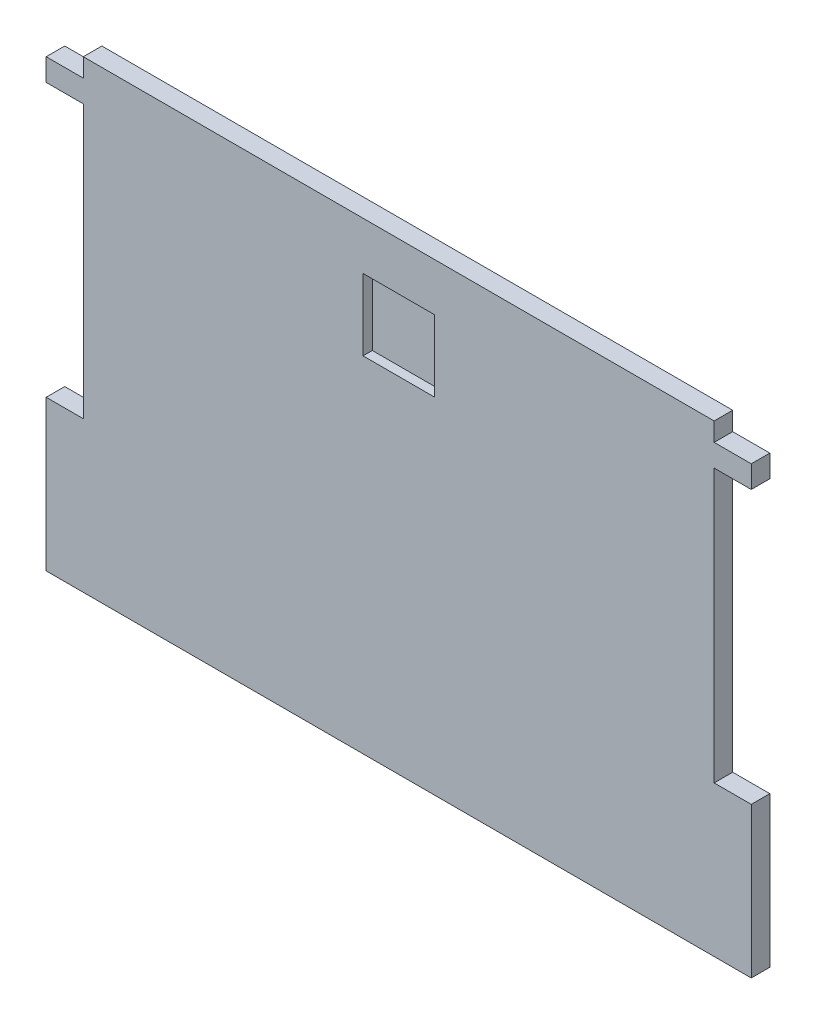
ISO-10303-21;
HEADER;
FILE_DESCRIPTION(('STEP AP214'),'2;1');
FILE_NAME('part.step','',(''),(''),'','','');
FILE_SCHEMA(('AUTOMOTIVE_DESIGN { 1 0 10303 214 1 1 1 1 }'));
ENDSEC;
DATA;
#1=APPLICATION_CONTEXT('core data for automotive mechanical design processes');
#2=APPLICATION_PROTOCOL_DEFINITION('international standard','automotive_design',2000,#1);
#3=PRODUCT_CONTEXT('',#1,'mechanical');
#4=PRODUCT('Part','Part','',(#3));
#5=PRODUCT_RELATED_PRODUCT_CATEGORY('part','',(#4));
#6=PRODUCT_DEFINITION_FORMATION('','',#4);
#7=PRODUCT_DEFINITION_CONTEXT('part definition',#1,'design');
#8=PRODUCT_DEFINITION('design','',#6,#7);
#9=PRODUCT_DEFINITION_SHAPE('','',#8);
#10=(LENGTH_UNIT() NAMED_UNIT(*) SI_UNIT(.MILLI.,.METRE.));
#11=(NAMED_UNIT(*) PLANE_ANGLE_UNIT() SI_UNIT($,.RADIAN.));
#12=(NAMED_UNIT(*) SI_UNIT($,.STERADIAN.) SOLID_ANGLE_UNIT());
#13=UNCERTAINTY_MEASURE_WITH_UNIT(LENGTH_MEASURE(1.E-05),#10,'distance_accuracy_value','');
#14=(GEOMETRIC_REPRESENTATION_CONTEXT(3) GLOBAL_UNCERTAINTY_ASSIGNED_CONTEXT((#13)) GLOBAL_UNIT_ASSIGNED_CONTEXT((#10,
#11,#12)) REPRESENTATION_CONTEXT('',''));
#15=CARTESIAN_POINT('',(0.,0.,0.));
#16=DIRECTION('',(0.,0.,1.));
#17=DIRECTION('',(1.,0.,0.));
#18=AXIS2_PLACEMENT_3D('',#15,#16,#17);
#19=CARTESIAN_POINT('',(0.,0.,1.));
#20=DIRECTION('',(0.,0.,-1.));
#21=DIRECTION('',(-1.,0.,0.));
#22=AXIS2_PLACEMENT_3D('',#19,#20,#21);
#23=PLANE('',#22);
#24=DIRECTION('',(-1.,0.,0.));
#25=VECTOR('',#24,1.);
#26=CARTESIAN_POINT('',(-17.,-0.5,1.));
#27=LINE('',#26,#25);
#28=CARTESIAN_POINT('',(17.,-0.5,1.));
#29=VERTEX_POINT('',#28);
#30=CARTESIAN_POINT('',(-17.,-0.5,1.));
#31=VERTEX_POINT('',#30);
#32=EDGE_CURVE('E244',#29,#31,#27,.T.);
#33=ORIENTED_EDGE('',*,*,#32,.T.);
#34=DIRECTION('',(0.,-1.,0.));
#35=VECTOR('',#34,1.);
#36=CARTESIAN_POINT('',(-17.,-1.5,1.));
#37=LINE('',#36,#35);
#38=CARTESIAN_POINT('',(-17.,-1.5,1.));
#39=VERTEX_POINT('',#38);
#40=EDGE_CURVE('E117',#31,#39,#37,.T.);
#41=ORIENTED_EDGE('',*,*,#40,.T.);
#42=DIRECTION('',(-1.,0.,0.));
#43=VECTOR('',#42,1.);
#44=CARTESIAN_POINT('',(-19.,-1.5,1.));
#45=LINE('',#44,#43);
#46=CARTESIAN_POINT('',(-19.,-1.5,1.));
#47=VERTEX_POINT('',#46);
#48=EDGE_CURVE('E236',#39,#47,#45,.T.);
#49=ORIENTED_EDGE('',*,*,#48,.T.);
#50=DIRECTION('',(0.,-1.,0.));
#51=VECTOR('',#50,1.);
#52=CARTESIAN_POINT('',(-19.,-2.7,1.));
#53=LINE('',#52,#51);
#54=CARTESIAN_POINT('',(-19.,-2.7,1.));
#55=VERTEX_POINT('',#54);
#56=EDGE_CURVE('E240',#47,#55,#53,.T.);
#57=ORIENTED_EDGE('',*,*,#56,.T.);
#58=DIRECTION('',(1.,0.,0.));
#59=VECTOR('',#58,1.);
#60=CARTESIAN_POINT('',(-17.,-2.7,1.));
#61=LINE('',#60,#59);
#62=CARTESIAN_POINT('',(-17.,-2.7,1.));
#63=VERTEX_POINT('',#62);
#64=EDGE_CURVE('E234',#55,#63,#61,.T.);
#65=ORIENTED_EDGE('',*,*,#64,.T.);
#66=DIRECTION('',(0.,-1.,0.));
#67=VECTOR('',#66,1.);
#68=CARTESIAN_POINT('',(-17.,-17.3947217067352,1.));
#69=LINE('',#68,#67);
#70=CARTESIAN_POINT('',(-17.,-17.3947217067352,1.));
#71=VERTEX_POINT('',#70);
#72=EDGE_CURVE('E232',#63,#71,#69,.T.);
#73=ORIENTED_EDGE('',*,*,#72,.T.);
#74=DIRECTION('',(-1.,0.,0.));
#75=VECTOR('',#74,1.);
#76=CARTESIAN_POINT('',(-19.,-17.3947217067352,1.));
#77=LINE('',#76,#75);
#78=CARTESIAN_POINT('',(-19.,-17.3947217067352,1.));
#79=VERTEX_POINT('',#78);
#80=EDGE_CURVE('E231',#71,#79,#77,.T.);
#81=ORIENTED_EDGE('',*,*,#80,.T.);
#82=DIRECTION('',(0.,-1.,0.));
#83=VECTOR('',#82,1.);
#84=CARTESIAN_POINT('',(-19.,-25.5,1.));
#85=LINE('',#84,#83);
#86=CARTESIAN_POINT('',(-19.,-25.5,1.));
#87=VERTEX_POINT('',#86);
#88=EDGE_CURVE('E227',#79,#87,#85,.T.);
#89=ORIENTED_EDGE('',*,*,#88,.T.);
#90=DIRECTION('',(1.,0.,0.));
#91=VECTOR('',#90,1.);
#92=CARTESIAN_POINT('',(19.,-25.5,1.));
#93=LINE('',#92,#91);
#94=CARTESIAN_POINT('',(19.,-25.5,1.));
#95=VERTEX_POINT('',#94);
#96=EDGE_CURVE('E230',#87,#95,#93,.T.);
#97=ORIENTED_EDGE('',*,*,#96,.T.);
#98=DIRECTION('',(0.,1.,0.));
#99=VECTOR('',#98,1.);
#100=CARTESIAN_POINT('',(19.,-17.3947217067352,1.));
#101=LINE('',#100,#99);
#102=CARTESIAN_POINT('',(19.,-17.3947217067352,1.));
#103=VERTEX_POINT('',#102);
#104=EDGE_CURVE('E224',#95,#103,#101,.T.);
#105=ORIENTED_EDGE('',*,*,#104,.T.);
#106=DIRECTION('',(-1.,0.,0.));
#107=VECTOR('',#106,1.);
#108=CARTESIAN_POINT('',(17.,-17.3947217067352,1.));
#109=LINE('',#108,#107);
#110=CARTESIAN_POINT('',(17.,-17.3947217067352,1.));
#111=VERTEX_POINT('',#110);
#112=EDGE_CURVE('E223',#103,#111,#109,.T.);
#113=ORIENTED_EDGE('',*,*,#112,.T.);
#114=DIRECTION('',(0.,1.,0.));
#115=VECTOR('',#114,1.);
#116=CARTESIAN_POINT('',(17.,-2.7,1.));
#117=LINE('',#116,#115);
#118=CARTESIAN_POINT('',(17.,-2.7,1.));
#119=VERTEX_POINT('',#118);
#120=EDGE_CURVE('E221',#111,#119,#117,.T.);
#121=ORIENTED_EDGE('',*,*,#120,.T.);
#122=DIRECTION('',(1.,0.,0.));
#123=VECTOR('',#122,1.);
#124=CARTESIAN_POINT('',(19.,-2.7,1.));
#125=LINE('',#124,#123);
#126=CARTESIAN_POINT('',(19.,-2.7,1.));
#127=VERTEX_POINT('',#126);
#128=EDGE_CURVE('E219',#119,#127,#125,.T.);
#129=ORIENTED_EDGE('',*,*,#128,.T.);
#130=DIRECTION('',(0.,1.,0.));
#131=VECTOR('',#130,1.);
#132=CARTESIAN_POINT('',(19.,-1.5,1.));
#133=LINE('',#132,#131);
#134=CARTESIAN_POINT('',(19.,-1.5,1.));
#135=VERTEX_POINT('',#134);
#136=EDGE_CURVE('E220',#127,#135,#133,.T.);
#137=ORIENTED_EDGE('',*,*,#136,.T.);
#138=DIRECTION('',(-1.,0.,0.));
#139=VECTOR('',#138,1.);
#140=CARTESIAN_POINT('',(17.,-1.5,1.));
#141=LINE('',#140,#139);
#142=CARTESIAN_POINT('',(17.,-1.5,1.));
#143=VERTEX_POINT('',#142);
#144=EDGE_CURVE('E215',#135,#143,#141,.T.);
#145=ORIENTED_EDGE('',*,*,#144,.T.);
#146=DIRECTION('',(0.,1.,0.));
#147=VECTOR('',#146,1.);
#148=CARTESIAN_POINT('',(17.,-0.5,1.));
#149=LINE('',#148,#147);
#150=EDGE_CURVE('E212',#143,#29,#149,.T.);
#151=ORIENTED_EDGE('',*,*,#150,.T.);
#152=EDGE_LOOP('',(#33,#41,#49,#57,#65,#73,#81,#89,#97,#105,#113,#121,#129,#137,#145,#151));
#153=FACE_BOUND('',#152,.T.);
#154=DIRECTION('',(1.,0.,0.));
#155=VECTOR('',#154,1.);
#156=CARTESIAN_POINT('',(-1.92307692307796,-3.07692307692307,1.));
#157=LINE('',#156,#155);
#158=CARTESIAN_POINT('',(-1.92307692307796,-3.07692307692307,1.));
#159=VERTEX_POINT('',#158);
#160=CARTESIAN_POINT('',(1.92307692307589,-3.07692307692307,1.));
#161=VERTEX_POINT('',#160);
#162=EDGE_CURVE('E53',#159,#161,#157,.T.);
#163=ORIENTED_EDGE('',*,*,#162,.T.);
#164=DIRECTION('',(0.,-1.,0.));
#165=VECTOR('',#164,1.);
#166=CARTESIAN_POINT('',(1.92307692307589,-3.07692307692307,1.));
#167=LINE('',#166,#165);
#168=CARTESIAN_POINT('',(1.92307692307589,-6.92307692307692,1.));
#169=VERTEX_POINT('',#168);
#170=EDGE_CURVE('E205',#161,#169,#167,.T.);
#171=ORIENTED_EDGE('',*,*,#170,.T.);
#172=DIRECTION('',(-1.,0.,0.));
#173=VECTOR('',#172,1.);
#174=CARTESIAN_POINT('',(1.92307692307589,-6.92307692307692,1.));
#175=LINE('',#174,#173);
#176=CARTESIAN_POINT('',(-1.92307692307796,-6.92307692307692,1.));
#177=VERTEX_POINT('',#176);
#178=EDGE_CURVE('E586',#169,#177,#175,.T.);
#179=ORIENTED_EDGE('',*,*,#178,.T.);
#180=DIRECTION('',(0.,1.,0.));
#181=VECTOR('',#180,1.);
#182=CARTESIAN_POINT('',(-1.92307692307796,-6.92307692307692,1.));
#183=LINE('',#182,#181);
#184=EDGE_CURVE('E200',#177,#159,#183,.T.);
#185=ORIENTED_EDGE('',*,*,#184,.T.);
#186=EDGE_LOOP('',(#163,#171,#179,#185));
#187=FACE_BOUND('',#186,.T.);
#188=ADVANCED_FACE('F39',(#153,#187),#23,.F.);
#189=CARTESIAN_POINT('',(-17.,-0.5,1.));
#190=DIRECTION('',(0.,-1.,0.));
#191=DIRECTION('',(0.,0.,-1.));
#192=AXIS2_PLACEMENT_3D('',#189,#190,#191);
#193=PLANE('',#192);
#194=DIRECTION('',(1.,0.,0.));
#195=VECTOR('',#194,1.);
#196=CARTESIAN_POINT('',(-17.,-0.5,0.));
#197=LINE('',#196,#195);
#198=CARTESIAN_POINT('',(17.,-0.5,0.));
#199=VERTEX_POINT('',#198);
#200=CARTESIAN_POINT('',(-17.,-0.5,0.));
#201=VERTEX_POINT('',#200);
#202=EDGE_CURVE('E11',#199,#201,#197,.F.);
#203=ORIENTED_EDGE('',*,*,#202,.T.);
#204=DIRECTION('',(0.,0.,-1.));
#205=VECTOR('',#204,1.);
#206=CARTESIAN_POINT('',(-17.,-0.5,1.));
#207=LINE('',#206,#205);
#208=EDGE_CURVE('E201',#31,#201,#207,.T.);
#209=ORIENTED_EDGE('',*,*,#208,.F.);
#210=ORIENTED_EDGE('',*,*,#32,.F.);
#211=DIRECTION('',(0.,0.,-1.));
#212=VECTOR('',#211,1.);
#213=CARTESIAN_POINT('',(17.,-0.5,1.));
#214=LINE('',#213,#212);
#215=EDGE_CURVE('E214',#29,#199,#214,.T.);
#216=ORIENTED_EDGE('',*,*,#215,.T.);
#217=EDGE_LOOP('',(#203,#209,#210,#216));
#218=FACE_BOUND('',#217,.T.);
#219=ADVANCED_FACE('F387',(#218),#193,.F.);
#220=CARTESIAN_POINT('',(-17.,-1.5,1.));
#221=DIRECTION('',(1.,0.,0.));
#222=DIRECTION('',(0.,0.,-1.));
#223=AXIS2_PLACEMENT_3D('',#220,#221,#222);
#224=PLANE('',#223);
#225=DIRECTION('',(0.,1.,0.));
#226=VECTOR('',#225,1.);
#227=CARTESIAN_POINT('',(-17.,-1.5,0.));
#228=LINE('',#227,#226);
#229=CARTESIAN_POINT('',(-17.,-1.5,0.));
#230=VERTEX_POINT('',#229);
#231=EDGE_CURVE('E50',#201,#230,#228,.F.);
#232=ORIENTED_EDGE('',*,*,#231,.T.);
#233=DIRECTION('',(0.,0.,-1.));
#234=VECTOR('',#233,1.);
#235=CARTESIAN_POINT('',(-17.,-1.5,1.));
#236=LINE('',#235,#234);
#237=EDGE_CURVE('E207',#39,#230,#236,.T.);
#238=ORIENTED_EDGE('',*,*,#237,.F.);
#239=ORIENTED_EDGE('',*,*,#40,.F.);
#240=ORIENTED_EDGE('',*,*,#208,.T.);
#241=EDGE_LOOP('',(#232,#238,#239,#240));
#242=FACE_BOUND('',#241,.T.);
#243=ADVANCED_FACE('F311',(#242),#224,.F.);
#244=CARTESIAN_POINT('',(-19.,-1.5,1.));
#245=DIRECTION('',(0.,-1.,0.));
#246=DIRECTION('',(1.,0.,0.));
#247=AXIS2_PLACEMENT_3D('',#244,#245,#246);
#248=PLANE('',#247);
#249=DIRECTION('',(1.,0.,0.));
#250=VECTOR('',#249,1.);
#251=CARTESIAN_POINT('',(-19.,-1.5,0.));
#252=LINE('',#251,#250);
#253=CARTESIAN_POINT('',(-19.,-1.5,0.));
#254=VERTEX_POINT('',#253);
#255=EDGE_CURVE('E307',#230,#254,#252,.F.);
#256=ORIENTED_EDGE('',*,*,#255,.T.);
#257=DIRECTION('',(0.,0.,-1.));
#258=VECTOR('',#257,1.);
#259=CARTESIAN_POINT('',(-19.,-1.5,1.));
#260=LINE('',#259,#258);
#261=EDGE_CURVE('E246',#47,#254,#260,.T.);
#262=ORIENTED_EDGE('',*,*,#261,.F.);
#263=ORIENTED_EDGE('',*,*,#48,.F.);
#264=ORIENTED_EDGE('',*,*,#237,.T.);
#265=EDGE_LOOP('',(#256,#262,#263,#264));
#266=FACE_BOUND('',#265,.T.);
#267=ADVANCED_FACE('F318',(#266),#248,.F.);
#268=CARTESIAN_POINT('',(-19.,-2.7,1.));
#269=DIRECTION('',(1.,0.,0.));
#270=DIRECTION('',(0.,0.,-1.));
#271=AXIS2_PLACEMENT_3D('',#268,#269,#270);
#272=PLANE('',#271);
#273=DIRECTION('',(0.,1.,0.));
#274=VECTOR('',#273,1.);
#275=CARTESIAN_POINT('',(-19.,-2.7,0.));
#276=LINE('',#275,#274);
#277=CARTESIAN_POINT('',(-19.,-2.7,0.));
#278=VERTEX_POINT('',#277);
#279=EDGE_CURVE('E306',#254,#278,#276,.F.);
#280=ORIENTED_EDGE('',*,*,#279,.T.);
#281=DIRECTION('',(0.,0.,-1.));
#282=VECTOR('',#281,1.);
#283=CARTESIAN_POINT('',(-19.,-2.7,1.));
#284=LINE('',#283,#282);
#285=EDGE_CURVE('E252',#55,#278,#284,.T.);
#286=ORIENTED_EDGE('',*,*,#285,.F.);
#287=ORIENTED_EDGE('',*,*,#56,.F.);
#288=ORIENTED_EDGE('',*,*,#261,.T.);
#289=EDGE_LOOP('',(#280,#286,#287,#288));
#290=FACE_BOUND('',#289,.T.);
#291=ADVANCED_FACE('F327',(#290),#272,.F.);
#292=CARTESIAN_POINT('',(-17.,-2.7,1.));
#293=DIRECTION('',(0.,1.,0.));
#294=DIRECTION('',(0.,0.,1.));
#295=AXIS2_PLACEMENT_3D('',#292,#293,#294);
#296=PLANE('',#295);
#297=DIRECTION('',(1.,0.,0.));
#298=VECTOR('',#297,1.);
#299=CARTESIAN_POINT('',(-17.,-2.7,0.));
#300=LINE('',#299,#298);
#301=CARTESIAN_POINT('',(-17.,-2.7,0.));
#302=VERTEX_POINT('',#301);
#303=EDGE_CURVE('E308',#278,#302,#300,.T.);
#304=ORIENTED_EDGE('',*,*,#303,.T.);
#305=DIRECTION('',(0.,0.,-1.));
#306=VECTOR('',#305,1.);
#307=CARTESIAN_POINT('',(-17.,-2.7,1.));
#308=LINE('',#307,#306);
#309=EDGE_CURVE('E251',#63,#302,#308,.T.);
#310=ORIENTED_EDGE('',*,*,#309,.F.);
#311=ORIENTED_EDGE('',*,*,#64,.F.);
#312=ORIENTED_EDGE('',*,*,#285,.T.);
#313=EDGE_LOOP('',(#304,#310,#311,#312));
#314=FACE_BOUND('',#313,.T.);
#315=ADVANCED_FACE('F328',(#314),#296,.F.);
#316=CARTESIAN_POINT('',(-17.,-17.3947217067352,1.));
#317=DIRECTION('',(1.,0.,0.));
#318=DIRECTION('',(0.,0.,-1.));
#319=AXIS2_PLACEMENT_3D('',#316,#317,#318);
#320=PLANE('',#319);
#321=DIRECTION('',(0.,1.,0.));
#322=VECTOR('',#321,1.);
#323=CARTESIAN_POINT('',(-17.,-17.3947217067352,0.));
#324=LINE('',#323,#322);
#325=CARTESIAN_POINT('',(-17.,-17.3947217067352,0.));
#326=VERTEX_POINT('',#325);
#327=EDGE_CURVE('E305',#302,#326,#324,.F.);
#328=ORIENTED_EDGE('',*,*,#327,.T.);
#329=DIRECTION('',(0.,0.,-1.));
#330=VECTOR('',#329,1.);
#331=CARTESIAN_POINT('',(-17.,-17.3947217067352,1.));
#332=LINE('',#331,#330);
#333=EDGE_CURVE('E257',#71,#326,#332,.T.);
#334=ORIENTED_EDGE('',*,*,#333,.F.);
#335=ORIENTED_EDGE('',*,*,#72,.F.);
#336=ORIENTED_EDGE('',*,*,#309,.T.);
#337=EDGE_LOOP('',(#328,#334,#335,#336));
#338=FACE_BOUND('',#337,.T.);
#339=ADVANCED_FACE('F336',(#338),#320,.F.);
#340=CARTESIAN_POINT('',(-19.,-17.3947217067352,1.));
#341=DIRECTION('',(0.,-1.,0.));
#342=DIRECTION('',(0.,0.,-1.));
#343=AXIS2_PLACEMENT_3D('',#340,#341,#342);
#344=PLANE('',#343);
#345=DIRECTION('',(1.,0.,0.));
#346=VECTOR('',#345,1.);
#347=CARTESIAN_POINT('',(-19.,-17.3947217067352,0.));
#348=LINE('',#347,#346);
#349=CARTESIAN_POINT('',(-19.,-17.3947217067352,0.));
#350=VERTEX_POINT('',#349);
#351=EDGE_CURVE('E302',#326,#350,#348,.F.);
#352=ORIENTED_EDGE('',*,*,#351,.T.);
#353=DIRECTION('',(0.,0.,-1.));
#354=VECTOR('',#353,1.);
#355=CARTESIAN_POINT('',(-19.,-17.3947217067352,1.));
#356=LINE('',#355,#354);
#357=EDGE_CURVE('E259',#79,#350,#356,.T.);
#358=ORIENTED_EDGE('',*,*,#357,.F.);
#359=ORIENTED_EDGE('',*,*,#80,.F.);
#360=ORIENTED_EDGE('',*,*,#333,.T.);
#361=EDGE_LOOP('',(#352,#358,#359,#360));
#362=FACE_BOUND('',#361,.T.);
#363=ADVANCED_FACE('F342',(#362),#344,.F.);
#364=CARTESIAN_POINT('',(-19.,-25.5,1.));
#365=DIRECTION('',(1.,0.,0.));
#366=DIRECTION('',(0.,0.,-1.));
#367=AXIS2_PLACEMENT_3D('',#364,#365,#366);
#368=PLANE('',#367);
#369=DIRECTION('',(0.,1.,0.));
#370=VECTOR('',#369,1.);
#371=CARTESIAN_POINT('',(-19.,-25.5,0.));
#372=LINE('',#371,#370);
#373=CARTESIAN_POINT('',(-19.,-25.5,0.));
#374=VERTEX_POINT('',#373);
#375=EDGE_CURVE('E298',#350,#374,#372,.F.);
#376=ORIENTED_EDGE('',*,*,#375,.T.);
#377=DIRECTION('',(0.,0.,-1.));
#378=VECTOR('',#377,1.);
#379=CARTESIAN_POINT('',(-19.,-25.5,1.));
#380=LINE('',#379,#378);
#381=EDGE_CURVE('E261',#87,#374,#380,.T.);
#382=ORIENTED_EDGE('',*,*,#381,.F.);
#383=ORIENTED_EDGE('',*,*,#88,.F.);
#384=ORIENTED_EDGE('',*,*,#357,.T.);
#385=EDGE_LOOP('',(#376,#382,#383,#384));
#386=FACE_BOUND('',#385,.T.);
#387=ADVANCED_FACE('F348',(#386),#368,.F.);
#388=CARTESIAN_POINT('',(19.,-25.5,1.));
#389=DIRECTION('',(0.,1.,0.));
#390=DIRECTION('',(0.,0.,1.));
#391=AXIS2_PLACEMENT_3D('',#388,#389,#390);
#392=PLANE('',#391);
#393=DIRECTION('',(1.,0.,0.));
#394=VECTOR('',#393,1.);
#395=CARTESIAN_POINT('',(19.,-25.5,0.));
#396=LINE('',#395,#394);
#397=CARTESIAN_POINT('',(19.,-25.5,0.));
#398=VERTEX_POINT('',#397);
#399=EDGE_CURVE('E300',#374,#398,#396,.T.);
#400=ORIENTED_EDGE('',*,*,#399,.T.);
#401=DIRECTION('',(0.,0.,-1.));
#402=VECTOR('',#401,1.);
#403=CARTESIAN_POINT('',(19.,-25.5,1.));
#404=LINE('',#403,#402);
#405=EDGE_CURVE('E266',#95,#398,#404,.T.);
#406=ORIENTED_EDGE('',*,*,#405,.F.);
#407=ORIENTED_EDGE('',*,*,#96,.F.);
#408=ORIENTED_EDGE('',*,*,#381,.T.);
#409=EDGE_LOOP('',(#400,#406,#407,#408));
#410=FACE_BOUND('',#409,.T.);
#411=ADVANCED_FACE('F355',(#410),#392,.F.);
#412=CARTESIAN_POINT('',(19.,-17.3947217067352,1.));
#413=DIRECTION('',(-1.,0.,0.));
#414=DIRECTION('',(0.,0.,1.));
#415=AXIS2_PLACEMENT_3D('',#412,#413,#414);
#416=PLANE('',#415);
#417=DIRECTION('',(0.,1.,0.));
#418=VECTOR('',#417,1.);
#419=CARTESIAN_POINT('',(19.,-17.3947217067352,0.));
#420=LINE('',#419,#418);
#421=CARTESIAN_POINT('',(19.,-17.3947217067352,0.));
#422=VERTEX_POINT('',#421);
#423=EDGE_CURVE('E297',#398,#422,#420,.T.);
#424=ORIENTED_EDGE('',*,*,#423,.T.);
#425=DIRECTION('',(0.,0.,-1.));
#426=VECTOR('',#425,1.);
#427=CARTESIAN_POINT('',(19.,-17.3947217067352,1.));
#428=LINE('',#427,#426);
#429=EDGE_CURVE('E267',#103,#422,#428,.T.);
#430=ORIENTED_EDGE('',*,*,#429,.F.);
#431=ORIENTED_EDGE('',*,*,#104,.F.);
#432=ORIENTED_EDGE('',*,*,#405,.T.);
#433=EDGE_LOOP('',(#424,#430,#431,#432));
#434=FACE_BOUND('',#433,.T.);
#435=ADVANCED_FACE('F356',(#434),#416,.F.);
#436=CARTESIAN_POINT('',(17.,-17.3947217067352,1.));
#437=DIRECTION('',(0.,-1.,0.));
#438=DIRECTION('',(0.,0.,-1.));
#439=AXIS2_PLACEMENT_3D('',#436,#437,#438);
#440=PLANE('',#439);
#441=DIRECTION('',(1.,0.,0.));
#442=VECTOR('',#441,1.);
#443=CARTESIAN_POINT('',(17.,-17.3947217067352,0.));
#444=LINE('',#443,#442);
#445=CARTESIAN_POINT('',(17.,-17.3947217067352,0.));
#446=VERTEX_POINT('',#445);
#447=EDGE_CURVE('E294',#422,#446,#444,.F.);
#448=ORIENTED_EDGE('',*,*,#447,.T.);
#449=DIRECTION('',(0.,0.,-1.));
#450=VECTOR('',#449,1.);
#451=CARTESIAN_POINT('',(17.,-17.3947217067352,1.));
#452=LINE('',#451,#450);
#453=EDGE_CURVE('E275',#111,#446,#452,.T.);
#454=ORIENTED_EDGE('',*,*,#453,.F.);
#455=ORIENTED_EDGE('',*,*,#112,.F.);
#456=ORIENTED_EDGE('',*,*,#429,.T.);
#457=EDGE_LOOP('',(#448,#454,#455,#456));
#458=FACE_BOUND('',#457,.T.);
#459=ADVANCED_FACE('F361',(#458),#440,.F.);
#460=CARTESIAN_POINT('',(17.,-2.7,1.));
#461=DIRECTION('',(-1.,0.,0.));
#462=DIRECTION('',(0.,0.,1.));
#463=AXIS2_PLACEMENT_3D('',#460,#461,#462);
#464=PLANE('',#463);
#465=DIRECTION('',(0.,1.,0.));
#466=VECTOR('',#465,1.);
#467=CARTESIAN_POINT('',(17.,-2.7,0.));
#468=LINE('',#467,#466);
#469=CARTESIAN_POINT('',(17.,-2.7,0.));
#470=VERTEX_POINT('',#469);
#471=EDGE_CURVE('E295',#446,#470,#468,.T.);
#472=ORIENTED_EDGE('',*,*,#471,.T.);
#473=DIRECTION('',(0.,0.,-1.));
#474=VECTOR('',#473,1.);
#475=CARTESIAN_POINT('',(17.,-2.7,1.));
#476=LINE('',#475,#474);
#477=EDGE_CURVE('E274',#119,#470,#476,.T.);
#478=ORIENTED_EDGE('',*,*,#477,.F.);
#479=ORIENTED_EDGE('',*,*,#120,.F.);
#480=ORIENTED_EDGE('',*,*,#453,.T.);
#481=EDGE_LOOP('',(#472,#478,#479,#480));
#482=FACE_BOUND('',#481,.T.);
#483=ADVANCED_FACE('F370',(#482),#464,.F.);
#484=CARTESIAN_POINT('',(19.,-2.7,1.));
#485=DIRECTION('',(0.,1.,0.));
#486=DIRECTION('',(0.,0.,1.));
#487=AXIS2_PLACEMENT_3D('',#484,#485,#486);
#488=PLANE('',#487);
#489=DIRECTION('',(1.,0.,0.));
#490=VECTOR('',#489,1.);
#491=CARTESIAN_POINT('',(19.,-2.7,0.));
#492=LINE('',#491,#490);
#493=CARTESIAN_POINT('',(19.,-2.7,0.));
#494=VERTEX_POINT('',#493);
#495=EDGE_CURVE('E288',#470,#494,#492,.T.);
#496=ORIENTED_EDGE('',*,*,#495,.T.);
#497=DIRECTION('',(0.,0.,-1.));
#498=VECTOR('',#497,1.);
#499=CARTESIAN_POINT('',(19.,-2.7,1.));
#500=LINE('',#499,#498);
#501=EDGE_CURVE('E277',#127,#494,#500,.T.);
#502=ORIENTED_EDGE('',*,*,#501,.F.);
#503=ORIENTED_EDGE('',*,*,#128,.F.);
#504=ORIENTED_EDGE('',*,*,#477,.T.);
#505=EDGE_LOOP('',(#496,#502,#503,#504));
#506=FACE_BOUND('',#505,.T.);
#507=ADVANCED_FACE('F372',(#506),#488,.F.);
#508=CARTESIAN_POINT('',(19.,-1.5,1.));
#509=DIRECTION('',(-1.,0.,0.));
#510=DIRECTION('',(0.,0.,1.));
#511=AXIS2_PLACEMENT_3D('',#508,#509,#510);
#512=PLANE('',#511);
#513=DIRECTION('',(0.,1.,0.));
#514=VECTOR('',#513,1.);
#515=CARTESIAN_POINT('',(19.,-1.5,0.));
#516=LINE('',#515,#514);
#517=CARTESIAN_POINT('',(19.,-1.5,0.));
#518=VERTEX_POINT('',#517);
#519=EDGE_CURVE('E290',#494,#518,#516,.T.);
#520=ORIENTED_EDGE('',*,*,#519,.T.);
#521=DIRECTION('',(0.,0.,-1.));
#522=VECTOR('',#521,1.);
#523=CARTESIAN_POINT('',(19.,-1.5,1.));
#524=LINE('',#523,#522);
#525=EDGE_CURVE('E282',#135,#518,#524,.T.);
#526=ORIENTED_EDGE('',*,*,#525,.F.);
#527=ORIENTED_EDGE('',*,*,#136,.F.);
#528=ORIENTED_EDGE('',*,*,#501,.T.);
#529=EDGE_LOOP('',(#520,#526,#527,#528));
#530=FACE_BOUND('',#529,.T.);
#531=ADVANCED_FACE('F377',(#530),#512,.F.);
#532=CARTESIAN_POINT('',(17.,-1.5,1.));
#533=DIRECTION('',(0.,-1.,0.));
#534=DIRECTION('',(1.,0.,0.));
#535=AXIS2_PLACEMENT_3D('',#532,#533,#534);
#536=PLANE('',#535);
#537=DIRECTION('',(1.,0.,0.));
#538=VECTOR('',#537,1.);
#539=CARTESIAN_POINT('',(17.,-1.5,0.));
#540=LINE('',#539,#538);
#541=CARTESIAN_POINT('',(17.,-1.5,0.));
#542=VERTEX_POINT('',#541);
#543=EDGE_CURVE('E287',#518,#542,#540,.F.);
#544=ORIENTED_EDGE('',*,*,#543,.T.);
#545=DIRECTION('',(0.,0.,-1.));
#546=VECTOR('',#545,1.);
#547=CARTESIAN_POINT('',(17.,-1.5,1.));
#548=LINE('',#547,#546);
#549=EDGE_CURVE('E241',#143,#542,#548,.T.);
#550=ORIENTED_EDGE('',*,*,#549,.F.);
#551=ORIENTED_EDGE('',*,*,#144,.F.);
#552=ORIENTED_EDGE('',*,*,#525,.T.);
#553=EDGE_LOOP('',(#544,#550,#551,#552));
#554=FACE_BOUND('',#553,.T.);
#555=ADVANCED_FACE('F382',(#554),#536,.F.);
#556=CARTESIAN_POINT('',(17.,-0.5,1.));
#557=DIRECTION('',(-1.,0.,0.));
#558=DIRECTION('',(0.,0.,1.));
#559=AXIS2_PLACEMENT_3D('',#556,#557,#558);
#560=PLANE('',#559);
#561=DIRECTION('',(0.,1.,0.));
#562=VECTOR('',#561,1.);
#563=CARTESIAN_POINT('',(17.,-0.5,0.));
#564=LINE('',#563,#562);
#565=EDGE_CURVE('E110',#542,#199,#564,.T.);
#566=ORIENTED_EDGE('',*,*,#565,.T.);
#567=ORIENTED_EDGE('',*,*,#215,.F.);
#568=ORIENTED_EDGE('',*,*,#150,.F.);
#569=ORIENTED_EDGE('',*,*,#549,.T.);
#570=EDGE_LOOP('',(#566,#567,#568,#569));
#571=FACE_BOUND('',#570,.T.);
#572=ADVANCED_FACE('F381',(#571),#560,.F.);
#573=CARTESIAN_POINT('',(0.,0.,0.));
#574=DIRECTION('',(0.,0.,-1.));
#575=DIRECTION('',(-1.,0.,0.));
#576=AXIS2_PLACEMENT_3D('',#573,#574,#575);
#577=PLANE('',#576);
#578=ORIENTED_EDGE('',*,*,#202,.F.);
#579=ORIENTED_EDGE('',*,*,#565,.F.);
#580=ORIENTED_EDGE('',*,*,#543,.F.);
#581=ORIENTED_EDGE('',*,*,#519,.F.);
#582=ORIENTED_EDGE('',*,*,#495,.F.);
#583=ORIENTED_EDGE('',*,*,#471,.F.);
#584=ORIENTED_EDGE('',*,*,#447,.F.);
#585=ORIENTED_EDGE('',*,*,#423,.F.);
#586=ORIENTED_EDGE('',*,*,#399,.F.);
#587=ORIENTED_EDGE('',*,*,#375,.F.);
#588=ORIENTED_EDGE('',*,*,#351,.F.);
#589=ORIENTED_EDGE('',*,*,#327,.F.);
#590=ORIENTED_EDGE('',*,*,#303,.F.);
#591=ORIENTED_EDGE('',*,*,#279,.F.);
#592=ORIENTED_EDGE('',*,*,#255,.F.);
#593=ORIENTED_EDGE('',*,*,#231,.F.);
#594=EDGE_LOOP('',(#578,#579,#580,#581,#582,#583,#584,#585,#586,#587,#588,#589,#590,#591,#592,#593));
#595=FACE_BOUND('',#594,.T.);
#596=ADVANCED_FACE('F321',(#595),#577,.T.);
#597=CARTESIAN_POINT('',(-1.92307692307796,-3.07692307692307,0.5));
#598=DIRECTION('',(0.,-1.,0.));
#599=DIRECTION('',(0.,0.,-1.));
#600=AXIS2_PLACEMENT_3D('',#597,#598,#599);
#601=PLANE('',#600);
#602=ORIENTED_EDGE('',*,*,#162,.F.);
#603=DIRECTION('',(0.,0.,1.));
#604=VECTOR('',#603,1.);
#605=CARTESIAN_POINT('',(-1.92307692307796,-3.07692307692307,0.5));
#606=LINE('',#605,#604);
#607=CARTESIAN_POINT('',(-1.92307692307796,-3.07692307692307,0.5));
#608=VERTEX_POINT('',#607);
#609=EDGE_CURVE('E199',#608,#159,#606,.T.);
#610=ORIENTED_EDGE('',*,*,#609,.F.);
#611=DIRECTION('',(1.,0.,0.));
#612=VECTOR('',#611,1.);
#613=CARTESIAN_POINT('',(-1.92307692307796,-3.07692307692307,0.5));
#614=LINE('',#613,#612);
#615=CARTESIAN_POINT('',(1.92307692307589,-3.07692307692307,0.5));
#616=VERTEX_POINT('',#615);
#617=EDGE_CURVE('E188',#608,#616,#614,.T.);
#618=ORIENTED_EDGE('',*,*,#617,.T.);
#619=DIRECTION('',(0.,0.,1.));
#620=VECTOR('',#619,1.);
#621=CARTESIAN_POINT('',(1.92307692307589,-3.07692307692307,0.5));
#622=LINE('',#621,#620);
#623=EDGE_CURVE('E197',#616,#161,#622,.T.);
#624=ORIENTED_EDGE('',*,*,#623,.T.);
#625=EDGE_LOOP('',(#602,#610,#618,#624));
#626=FACE_BOUND('',#625,.T.);
#627=ADVANCED_FACE('F193',(#626),#601,.T.);
#628=CARTESIAN_POINT('',(1.92307692307589,-3.07692307692307,0.5));
#629=DIRECTION('',(-1.,0.,0.));
#630=DIRECTION('',(0.,0.,1.));
#631=AXIS2_PLACEMENT_3D('',#628,#629,#630);
#632=PLANE('',#631);
#633=ORIENTED_EDGE('',*,*,#170,.F.);
#634=ORIENTED_EDGE('',*,*,#623,.F.);
#635=DIRECTION('',(0.,-1.,0.));
#636=VECTOR('',#635,1.);
#637=CARTESIAN_POINT('',(1.92307692307589,-3.07692307692307,0.5));
#638=LINE('',#637,#636);
#639=CARTESIAN_POINT('',(1.92307692307589,-6.92307692307692,0.5));
#640=VERTEX_POINT('',#639);
#641=EDGE_CURVE('E184',#616,#640,#638,.T.);
#642=ORIENTED_EDGE('',*,*,#641,.T.);
#643=DIRECTION('',(0.,0.,1.));
#644=VECTOR('',#643,1.);
#645=CARTESIAN_POINT('',(1.92307692307589,-6.92307692307692,0.5));
#646=LINE('',#645,#644);
#647=EDGE_CURVE('E204',#640,#169,#646,.T.);
#648=ORIENTED_EDGE('',*,*,#647,.T.);
#649=EDGE_LOOP('',(#633,#634,#642,#648));
#650=FACE_BOUND('',#649,.T.);
#651=ADVANCED_FACE('F198',(#650),#632,.T.);
#652=CARTESIAN_POINT('',(1.92307692307589,-6.92307692307692,0.5));
#653=DIRECTION('',(0.,1.,0.));
#654=DIRECTION('',(0.,0.,1.));
#655=AXIS2_PLACEMENT_3D('',#652,#653,#654);
#656=PLANE('',#655);
#657=ORIENTED_EDGE('',*,*,#178,.F.);
#658=ORIENTED_EDGE('',*,*,#647,.F.);
#659=DIRECTION('',(-1.,0.,0.));
#660=VECTOR('',#659,1.);
#661=CARTESIAN_POINT('',(1.92307692307589,-6.92307692307692,0.5));
#662=LINE('',#661,#660);
#663=CARTESIAN_POINT('',(-1.92307692307796,-6.92307692307692,0.5));
#664=VERTEX_POINT('',#663);
#665=EDGE_CURVE('E189',#640,#664,#662,.T.);
#666=ORIENTED_EDGE('',*,*,#665,.T.);
#667=DIRECTION('',(0.,0.,1.));
#668=VECTOR('',#667,1.);
#669=CARTESIAN_POINT('',(-1.92307692307796,-6.92307692307692,0.5));
#670=LINE('',#669,#668);
#671=EDGE_CURVE('E210',#664,#177,#670,.T.);
#672=ORIENTED_EDGE('',*,*,#671,.T.);
#673=EDGE_LOOP('',(#657,#658,#666,#672));
#674=FACE_BOUND('',#673,.T.);
#675=ADVANCED_FACE('F435',(#674),#656,.T.);
#676=CARTESIAN_POINT('',(-1.92307692307796,-6.92307692307692,0.5));
#677=DIRECTION('',(1.,0.,0.));
#678=DIRECTION('',(0.,0.,-1.));
#679=AXIS2_PLACEMENT_3D('',#676,#677,#678);
#680=PLANE('',#679);
#681=ORIENTED_EDGE('',*,*,#184,.F.);
#682=ORIENTED_EDGE('',*,*,#671,.F.);
#683=DIRECTION('',(0.,1.,0.));
#684=VECTOR('',#683,1.);
#685=CARTESIAN_POINT('',(-1.92307692307796,-6.92307692307692,0.5));
#686=LINE('',#685,#684);
#687=EDGE_CURVE('E592',#664,#608,#686,.T.);
#688=ORIENTED_EDGE('',*,*,#687,.T.);
#689=ORIENTED_EDGE('',*,*,#609,.T.);
#690=EDGE_LOOP('',(#681,#682,#688,#689));
#691=FACE_BOUND('',#690,.T.);
#692=ADVANCED_FACE('F436',(#691),#680,.T.);
#693=CARTESIAN_POINT('',(0.,0.,0.5));
#694=DIRECTION('',(0.,0.,-1.));
#695=DIRECTION('',(-1.,0.,0.));
#696=AXIS2_PLACEMENT_3D('',#693,#694,#695);
#697=PLANE('',#696);
#698=ORIENTED_EDGE('',*,*,#617,.F.);
#699=ORIENTED_EDGE('',*,*,#687,.F.);
#700=ORIENTED_EDGE('',*,*,#665,.F.);
#701=ORIENTED_EDGE('',*,*,#641,.F.);
#702=EDGE_LOOP('',(#698,#699,#700,#701));
#703=FACE_BOUND('',#702,.T.);
#704=ADVANCED_FACE('F190',(#703),#697,.F.);
#705=CLOSED_SHELL('',(#188,#219,#243,#267,#291,#315,#339,#363,#387,#411,#435,#459,#483,#507,
#531,#555,#572,#596,#627,#651,#675,#692,#704));
#706=MANIFOLD_SOLID_BREP('B2',#705);
#707=ADVANCED_BREP_SHAPE_REPRESENTATION('',(#18,#706),#14);
#708=SHAPE_DEFINITION_REPRESENTATION(#9,#707);
ENDSEC;
END-ISO-10303-21;
